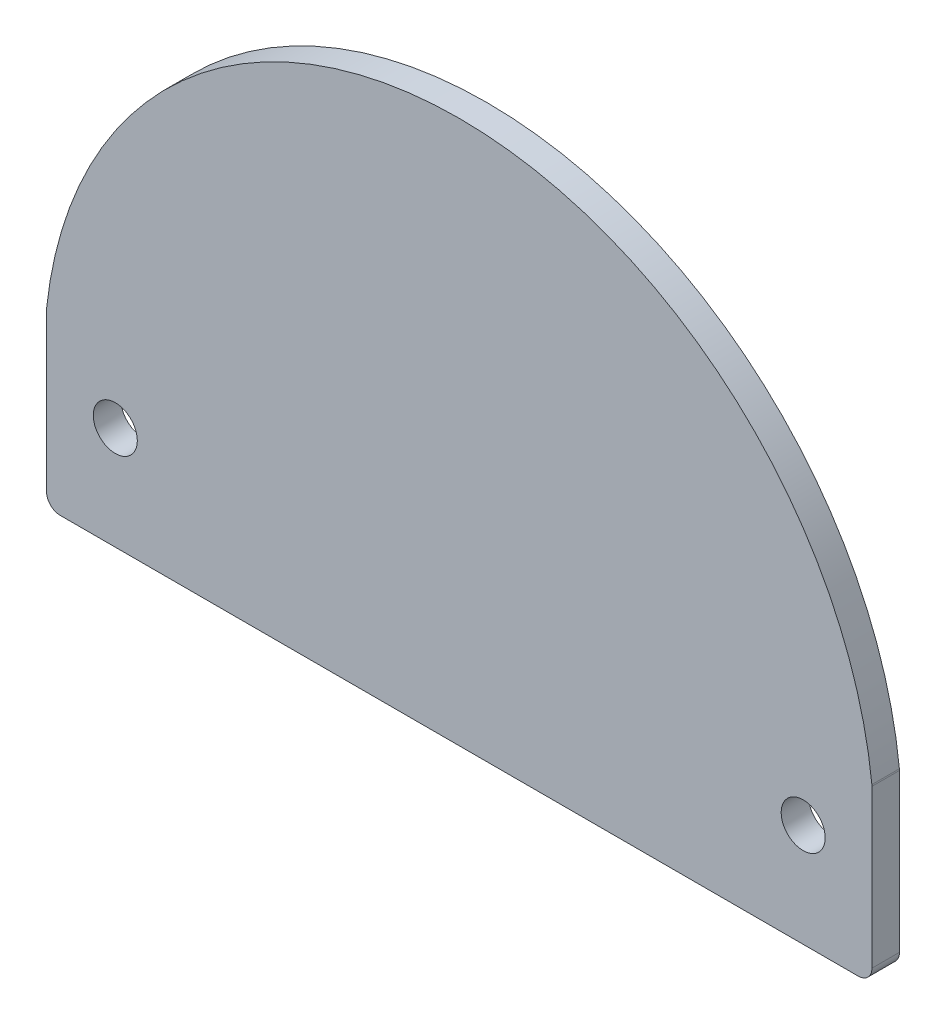
ISO-10303-21;
HEADER;
FILE_DESCRIPTION(('STEP AP214'),'2;1');
FILE_NAME('part.step','',(''),(''),'','','');
FILE_SCHEMA(('AUTOMOTIVE_DESIGN { 1 0 10303 214 1 1 1 1 }'));
ENDSEC;
DATA;
#1=APPLICATION_CONTEXT('core data for automotive mechanical design processes');
#2=APPLICATION_PROTOCOL_DEFINITION('international standard','automotive_design',2000,#1);
#3=PRODUCT_CONTEXT('',#1,'mechanical');
#4=PRODUCT('Part','Part','',(#3));
#5=PRODUCT_RELATED_PRODUCT_CATEGORY('part','',(#4));
#6=PRODUCT_DEFINITION_FORMATION('','',#4);
#7=PRODUCT_DEFINITION_CONTEXT('part definition',#1,'design');
#8=PRODUCT_DEFINITION('design','',#6,#7);
#9=PRODUCT_DEFINITION_SHAPE('','',#8);
#10=(LENGTH_UNIT() NAMED_UNIT(*) SI_UNIT(.MILLI.,.METRE.));
#11=(NAMED_UNIT(*) PLANE_ANGLE_UNIT() SI_UNIT($,.RADIAN.));
#12=(NAMED_UNIT(*) SI_UNIT($,.STERADIAN.) SOLID_ANGLE_UNIT());
#13=UNCERTAINTY_MEASURE_WITH_UNIT(LENGTH_MEASURE(1.E-05),#10,'distance_accuracy_value','');
#14=(GEOMETRIC_REPRESENTATION_CONTEXT(3) GLOBAL_UNCERTAINTY_ASSIGNED_CONTEXT((#13)) GLOBAL_UNIT_ASSIGNED_CONTEXT((#10,
#11,#12)) REPRESENTATION_CONTEXT('',''));
#15=CARTESIAN_POINT('',(0.,0.,0.));
#16=DIRECTION('',(0.,0.,1.));
#17=DIRECTION('',(1.,0.,0.));
#18=AXIS2_PLACEMENT_3D('',#15,#16,#17);
#19=CARTESIAN_POINT('',(0.,-3.16666666666667,2.));
#20=DIRECTION('',(0.,0.,-1.));
#21=DIRECTION('',(-1.,0.,0.));
#22=AXIS2_PLACEMENT_3D('',#19,#20,#21);
#23=CYLINDRICAL_SURFACE('',#22,30.1666666666667);
#24=CARTESIAN_POINT('',(0.,-3.16666666666667,2.));
#25=DIRECTION('',(0.,0.,1.));
#26=DIRECTION('',(-1.,0.,0.));
#27=AXIS2_PLACEMENT_3D('',#24,#25,#26);
#28=CIRCLE('',#27,30.1666666666667);
#29=CARTESIAN_POINT('',(29.9942857142857,0.0536752821911997,2.));
#30=VERTEX_POINT('',#29);
#31=CARTESIAN_POINT('',(-29.9942857142857,0.0536752821912001,2.));
#32=VERTEX_POINT('',#31);
#33=EDGE_CURVE('E134',#30,#32,#28,.T.);
#34=ORIENTED_EDGE('',*,*,#33,.F.);
#35=DIRECTION('',(0.,0.,-1.));
#36=VECTOR('',#35,1.);
#37=CARTESIAN_POINT('',(29.9942857142857,0.0536752821912001,2.));
#38=LINE('',#37,#36);
#39=CARTESIAN_POINT('',(29.9942857142857,0.0536752821911997,0.));
#40=VERTEX_POINT('',#39);
#41=EDGE_CURVE('E11',#30,#40,#38,.T.);
#42=ORIENTED_EDGE('',*,*,#41,.T.);
#43=CARTESIAN_POINT('',(0.,-3.16666666666667,0.));
#44=DIRECTION('',(0.,0.,1.));
#45=DIRECTION('',(-1.,0.,0.));
#46=AXIS2_PLACEMENT_3D('',#43,#44,#45);
#47=CIRCLE('',#46,30.1666666666667);
#48=CARTESIAN_POINT('',(-29.9942857142857,0.0536752821912001,0.));
#49=VERTEX_POINT('',#48);
#50=EDGE_CURVE('E136',#40,#49,#47,.T.);
#51=ORIENTED_EDGE('',*,*,#50,.T.);
#52=DIRECTION('',(0.,0.,-1.));
#53=VECTOR('',#52,1.);
#54=CARTESIAN_POINT('',(-29.9942857142857,0.0536752821912009,2.));
#55=LINE('',#54,#53);
#56=EDGE_CURVE('E47',#49,#32,#55,.F.);
#57=ORIENTED_EDGE('',*,*,#56,.T.);
#58=EDGE_LOOP('',(#34,#42,#51,#57));
#59=FACE_BOUND('',#58,.T.);
#60=ADVANCED_FACE('F39',(#59),#23,.T.);
#61=CARTESIAN_POINT('',(-30.,0.,2.));
#62=DIRECTION('',(1.,0.,0.));
#63=DIRECTION('',(0.,0.,-1.));
#64=AXIS2_PLACEMENT_3D('',#61,#62,#63);
#65=PLANE('',#64);
#66=DIRECTION('',(0.,-1.,0.));
#67=VECTOR('',#66,1.);
#68=CARTESIAN_POINT('',(-30.,0.,0.));
#69=LINE('',#68,#67);
#70=CARTESIAN_POINT('',(-30.,-0.053076384621768,0.));
#71=VERTEX_POINT('',#70);
#72=CARTESIAN_POINT('',(-30.,-11.5,0.));
#73=VERTEX_POINT('',#72);
#74=EDGE_CURVE('E132',#71,#73,#69,.T.);
#75=ORIENTED_EDGE('',*,*,#74,.T.);
#76=DIRECTION('',(0.,0.,-1.));
#77=VECTOR('',#76,1.);
#78=CARTESIAN_POINT('',(-30.,-11.5,2.));
#79=LINE('',#78,#77);
#80=CARTESIAN_POINT('',(-30.,-11.5,2.));
#81=VERTEX_POINT('',#80);
#82=EDGE_CURVE('E111',#73,#81,#79,.F.);
#83=ORIENTED_EDGE('',*,*,#82,.T.);
#84=DIRECTION('',(0.,-1.,0.));
#85=VECTOR('',#84,1.);
#86=CARTESIAN_POINT('',(-30.,0.,2.));
#87=LINE('',#86,#85);
#88=CARTESIAN_POINT('',(-30.,-0.053076384621768,2.));
#89=VERTEX_POINT('',#88);
#90=EDGE_CURVE('E172',#89,#81,#87,.T.);
#91=ORIENTED_EDGE('',*,*,#90,.F.);
#92=DIRECTION('',(0.,0.,-1.));
#93=VECTOR('',#92,1.);
#94=CARTESIAN_POINT('',(-30.,-0.053076384621768,2.));
#95=LINE('',#94,#93);
#96=EDGE_CURVE('E116',#89,#71,#95,.T.);
#97=ORIENTED_EDGE('',*,*,#96,.T.);
#98=EDGE_LOOP('',(#75,#83,#91,#97));
#99=FACE_BOUND('',#98,.T.);
#100=ADVANCED_FACE('F176',(#99),#65,.F.);
#101=CARTESIAN_POINT('',(-30.,-12.5,2.));
#102=DIRECTION('',(0.,1.,0.));
#103=DIRECTION('',(0.,0.,1.));
#104=AXIS2_PLACEMENT_3D('',#101,#102,#103);
#105=PLANE('',#104);
#106=DIRECTION('',(1.,0.,0.));
#107=VECTOR('',#106,1.);
#108=CARTESIAN_POINT('',(-30.,-12.5,2.));
#109=LINE('',#108,#107);
#110=CARTESIAN_POINT('',(-29.,-12.5,2.));
#111=VERTEX_POINT('',#110);
#112=CARTESIAN_POINT('',(29.,-12.5,2.));
#113=VERTEX_POINT('',#112);
#114=EDGE_CURVE('E125',#111,#113,#109,.T.);
#115=ORIENTED_EDGE('',*,*,#114,.F.);
#116=DIRECTION('',(0.,0.,-1.));
#117=VECTOR('',#116,1.);
#118=CARTESIAN_POINT('',(-29.,-12.5,2.));
#119=LINE('',#118,#117);
#120=CARTESIAN_POINT('',(-29.,-12.5,0.));
#121=VERTEX_POINT('',#120);
#122=EDGE_CURVE('E110',#111,#121,#119,.T.);
#123=ORIENTED_EDGE('',*,*,#122,.T.);
#124=DIRECTION('',(1.,0.,0.));
#125=VECTOR('',#124,1.);
#126=CARTESIAN_POINT('',(-30.,-12.5,0.));
#127=LINE('',#126,#125);
#128=CARTESIAN_POINT('',(29.,-12.5,0.));
#129=VERTEX_POINT('',#128);
#130=EDGE_CURVE('E123',#121,#129,#127,.T.);
#131=ORIENTED_EDGE('',*,*,#130,.T.);
#132=DIRECTION('',(0.,0.,-1.));
#133=VECTOR('',#132,1.);
#134=CARTESIAN_POINT('',(29.,-12.5,2.));
#135=LINE('',#134,#133);
#136=EDGE_CURVE('E127',#129,#113,#135,.F.);
#137=ORIENTED_EDGE('',*,*,#136,.T.);
#138=EDGE_LOOP('',(#115,#123,#131,#137));
#139=FACE_BOUND('',#138,.T.);
#140=ADVANCED_FACE('F122',(#139),#105,.F.);
#141=CARTESIAN_POINT('',(30.,0.,2.));
#142=DIRECTION('',(-1.,0.,0.));
#143=DIRECTION('',(0.,0.,1.));
#144=AXIS2_PLACEMENT_3D('',#141,#142,#143);
#145=PLANE('',#144);
#146=DIRECTION('',(0.,1.,0.));
#147=VECTOR('',#146,1.);
#148=CARTESIAN_POINT('',(30.,0.,2.));
#149=LINE('',#148,#147);
#150=CARTESIAN_POINT('',(30.,-11.5,2.));
#151=VERTEX_POINT('',#150);
#152=CARTESIAN_POINT('',(30.,-0.053076384621768,2.));
#153=VERTEX_POINT('',#152);
#154=EDGE_CURVE('E140',#151,#153,#149,.T.);
#155=ORIENTED_EDGE('',*,*,#154,.F.);
#156=DIRECTION('',(0.,0.,-1.));
#157=VECTOR('',#156,1.);
#158=CARTESIAN_POINT('',(30.,-11.5,2.));
#159=LINE('',#158,#157);
#160=CARTESIAN_POINT('',(30.,-11.5,0.));
#161=VERTEX_POINT('',#160);
#162=EDGE_CURVE('E157',#151,#161,#159,.T.);
#163=ORIENTED_EDGE('',*,*,#162,.T.);
#164=DIRECTION('',(0.,1.,0.));
#165=VECTOR('',#164,1.);
#166=CARTESIAN_POINT('',(30.,0.,0.));
#167=LINE('',#166,#165);
#168=CARTESIAN_POINT('',(30.,-0.053076384621768,0.));
#169=VERTEX_POINT('',#168);
#170=EDGE_CURVE('E131',#161,#169,#167,.T.);
#171=ORIENTED_EDGE('',*,*,#170,.T.);
#172=DIRECTION('',(0.,0.,-1.));
#173=VECTOR('',#172,1.);
#174=CARTESIAN_POINT('',(30.,-0.053076384621768,2.));
#175=LINE('',#174,#173);
#176=EDGE_CURVE('E54',#169,#153,#175,.F.);
#177=ORIENTED_EDGE('',*,*,#176,.T.);
#178=EDGE_LOOP('',(#155,#163,#171,#177));
#179=FACE_BOUND('',#178,.T.);
#180=ADVANCED_FACE('F205',(#179),#145,.F.);
#181=CARTESIAN_POINT('',(0.,-3.16666666666667,2.));
#182=DIRECTION('',(0.,0.,-1.));
#183=DIRECTION('',(-1.,0.,0.));
#184=AXIS2_PLACEMENT_3D('',#181,#182,#183);
#185=PLANE('',#184);
#186=CARTESIAN_POINT('',(25.,-5.,2.));
#187=DIRECTION('',(0.,0.,-1.));
#188=DIRECTION('',(-1.,0.,0.));
#189=AXIS2_PLACEMENT_3D('',#186,#187,#188);
#190=CIRCLE('',#189,1.6);
#191=CARTESIAN_POINT('',(23.4,-5.,2.));
#192=VERTEX_POINT('',#191);
#193=EDGE_CURVE('E187',#192,#192,#190,.T.);
#194=ORIENTED_EDGE('',*,*,#193,.T.);
#195=EDGE_LOOP('',(#194));
#196=FACE_BOUND('',#195,.T.);
#197=CARTESIAN_POINT('',(-25.,-5.,2.));
#198=DIRECTION('',(0.,0.,-1.));
#199=DIRECTION('',(-1.,0.,0.));
#200=AXIS2_PLACEMENT_3D('',#197,#198,#199);
#201=CIRCLE('',#200,1.6);
#202=CARTESIAN_POINT('',(-26.6,-5.,2.));
#203=VERTEX_POINT('',#202);
#204=EDGE_CURVE('E177',#203,#203,#201,.T.);
#205=ORIENTED_EDGE('',*,*,#204,.T.);
#206=EDGE_LOOP('',(#205));
#207=FACE_BOUND('',#206,.T.);
#208=ORIENTED_EDGE('',*,*,#90,.T.);
#209=CARTESIAN_POINT('',(-29.,-11.5,2.));
#210=DIRECTION('',(0.,0.,-1.));
#211=DIRECTION('',(-1.,0.,0.));
#212=AXIS2_PLACEMENT_3D('',#209,#210,#211);
#213=CIRCLE('',#212,1.);
#214=EDGE_CURVE('E154',#81,#111,#213,.F.);
#215=ORIENTED_EDGE('',*,*,#214,.T.);
#216=ORIENTED_EDGE('',*,*,#114,.T.);
#217=CARTESIAN_POINT('',(29.,-11.5,2.));
#218=DIRECTION('',(0.,0.,-1.));
#219=DIRECTION('',(-1.,0.,0.));
#220=AXIS2_PLACEMENT_3D('',#217,#218,#219);
#221=CIRCLE('',#220,1.);
#222=EDGE_CURVE('E61',#113,#151,#221,.F.);
#223=ORIENTED_EDGE('',*,*,#222,.T.);
#224=ORIENTED_EDGE('',*,*,#154,.T.);
#225=CARTESIAN_POINT('',(29.,-0.053076384621768,2.));
#226=DIRECTION('',(0.,0.,-1.));
#227=DIRECTION('',(-1.,0.,0.));
#228=AXIS2_PLACEMENT_3D('',#225,#226,#227);
#229=CIRCLE('',#228,1.);
#230=EDGE_CURVE('E151',#153,#30,#229,.F.);
#231=ORIENTED_EDGE('',*,*,#230,.T.);
#232=ORIENTED_EDGE('',*,*,#33,.T.);
#233=CARTESIAN_POINT('',(-29.,-0.053076384621768,2.));
#234=DIRECTION('',(0.,0.,-1.));
#235=DIRECTION('',(-1.,0.,0.));
#236=AXIS2_PLACEMENT_3D('',#233,#234,#235);
#237=CIRCLE('',#236,1.);
#238=EDGE_CURVE('E149',#32,#89,#237,.F.);
#239=ORIENTED_EDGE('',*,*,#238,.T.);
#240=EDGE_LOOP('',(#208,#215,#216,#223,#224,#231,#232,#239));
#241=FACE_BOUND('',#240,.T.);
#242=ADVANCED_FACE('F169',(#196,#207,#241),#185,.F.);
#243=CARTESIAN_POINT('',(0.,-3.16666666666667,0.));
#244=DIRECTION('',(0.,0.,-1.));
#245=DIRECTION('',(-1.,0.,0.));
#246=AXIS2_PLACEMENT_3D('',#243,#244,#245);
#247=PLANE('',#246);
#248=CARTESIAN_POINT('',(25.,-5.,0.));
#249=DIRECTION('',(0.,0.,1.));
#250=DIRECTION('',(1.,0.,0.));
#251=AXIS2_PLACEMENT_3D('',#248,#249,#250);
#252=CIRCLE('',#251,1.6);
#253=CARTESIAN_POINT('',(26.6,-5.,0.));
#254=VERTEX_POINT('',#253);
#255=EDGE_CURVE('E190',#254,#254,#252,.T.);
#256=ORIENTED_EDGE('',*,*,#255,.T.);
#257=EDGE_LOOP('',(#256));
#258=FACE_BOUND('',#257,.T.);
#259=CARTESIAN_POINT('',(-25.,-5.,0.));
#260=DIRECTION('',(0.,0.,1.));
#261=DIRECTION('',(1.,0.,0.));
#262=AXIS2_PLACEMENT_3D('',#259,#260,#261);
#263=CIRCLE('',#262,1.6);
#264=CARTESIAN_POINT('',(-23.4,-5.,0.));
#265=VERTEX_POINT('',#264);
#266=EDGE_CURVE('E179',#265,#265,#263,.T.);
#267=ORIENTED_EDGE('',*,*,#266,.T.);
#268=EDGE_LOOP('',(#267));
#269=FACE_BOUND('',#268,.T.);
#270=ORIENTED_EDGE('',*,*,#130,.F.);
#271=CARTESIAN_POINT('',(-29.,-11.5,0.));
#272=DIRECTION('',(0.,0.,-1.));
#273=DIRECTION('',(-1.,0.,0.));
#274=AXIS2_PLACEMENT_3D('',#271,#272,#273);
#275=CIRCLE('',#274,1.);
#276=EDGE_CURVE('E106',#121,#73,#275,.T.);
#277=ORIENTED_EDGE('',*,*,#276,.T.);
#278=ORIENTED_EDGE('',*,*,#74,.F.);
#279=CARTESIAN_POINT('',(-29.,-0.053076384621768,0.));
#280=DIRECTION('',(0.,0.,-1.));
#281=DIRECTION('',(-1.,0.,0.));
#282=AXIS2_PLACEMENT_3D('',#279,#280,#281);
#283=CIRCLE('',#282,1.);
#284=EDGE_CURVE('E126',#71,#49,#283,.T.);
#285=ORIENTED_EDGE('',*,*,#284,.T.);
#286=ORIENTED_EDGE('',*,*,#50,.F.);
#287=CARTESIAN_POINT('',(29.,-0.053076384621768,0.));
#288=DIRECTION('',(0.,0.,-1.));
#289=DIRECTION('',(-1.,0.,0.));
#290=AXIS2_PLACEMENT_3D('',#287,#288,#289);
#291=CIRCLE('',#290,1.);
#292=EDGE_CURVE('E143',#40,#169,#291,.T.);
#293=ORIENTED_EDGE('',*,*,#292,.T.);
#294=ORIENTED_EDGE('',*,*,#170,.F.);
#295=CARTESIAN_POINT('',(29.,-11.5,0.));
#296=DIRECTION('',(0.,0.,-1.));
#297=DIRECTION('',(-1.,0.,0.));
#298=AXIS2_PLACEMENT_3D('',#295,#296,#297);
#299=CIRCLE('',#298,1.);
#300=EDGE_CURVE('E117',#161,#129,#299,.T.);
#301=ORIENTED_EDGE('',*,*,#300,.T.);
#302=EDGE_LOOP('',(#270,#277,#278,#285,#286,#293,#294,#301));
#303=FACE_BOUND('',#302,.T.);
#304=ADVANCED_FACE('F129',(#258,#269,#303),#247,.T.);
#305=CARTESIAN_POINT('',(-25.,-5.,0.));
#306=DIRECTION('',(0.,0.,1.));
#307=DIRECTION('',(1.,0.,0.));
#308=AXIS2_PLACEMENT_3D('',#305,#306,#307);
#309=CYLINDRICAL_SURFACE('',#308,1.6);
#310=ORIENTED_EDGE('',*,*,#266,.F.);
#311=EDGE_LOOP('',(#310));
#312=FACE_BOUND('',#311,.T.);
#313=ORIENTED_EDGE('',*,*,#204,.F.);
#314=EDGE_LOOP('',(#313));
#315=FACE_BOUND('',#314,.T.);
#316=ADVANCED_FACE('F199',(#312,#315),#309,.F.);
#317=CARTESIAN_POINT('',(25.,-5.,0.));
#318=DIRECTION('',(0.,0.,1.));
#319=DIRECTION('',(1.,0.,0.));
#320=AXIS2_PLACEMENT_3D('',#317,#318,#319);
#321=CYLINDRICAL_SURFACE('',#320,1.6);
#322=ORIENTED_EDGE('',*,*,#255,.F.);
#323=EDGE_LOOP('',(#322));
#324=FACE_BOUND('',#323,.T.);
#325=ORIENTED_EDGE('',*,*,#193,.F.);
#326=EDGE_LOOP('',(#325));
#327=FACE_BOUND('',#326,.T.);
#328=ADVANCED_FACE('F196',(#324,#327),#321,.F.);
#329=CARTESIAN_POINT('',(-29.,-11.5,2.));
#330=DIRECTION('',(0.,0.,-1.));
#331=DIRECTION('',(-1.,0.,0.));
#332=AXIS2_PLACEMENT_3D('',#329,#330,#331);
#333=CYLINDRICAL_SURFACE('',#332,1.);
#334=ORIENTED_EDGE('',*,*,#214,.F.);
#335=ORIENTED_EDGE('',*,*,#82,.F.);
#336=ORIENTED_EDGE('',*,*,#276,.F.);
#337=ORIENTED_EDGE('',*,*,#122,.F.);
#338=EDGE_LOOP('',(#334,#335,#336,#337));
#339=FACE_BOUND('',#338,.T.);
#340=ADVANCED_FACE('F109',(#339),#333,.T.);
#341=CARTESIAN_POINT('',(29.,-11.5,2.));
#342=DIRECTION('',(0.,0.,-1.));
#343=DIRECTION('',(-1.,0.,0.));
#344=AXIS2_PLACEMENT_3D('',#341,#342,#343);
#345=CYLINDRICAL_SURFACE('',#344,1.);
#346=ORIENTED_EDGE('',*,*,#222,.F.);
#347=ORIENTED_EDGE('',*,*,#136,.F.);
#348=ORIENTED_EDGE('',*,*,#300,.F.);
#349=ORIENTED_EDGE('',*,*,#162,.F.);
#350=EDGE_LOOP('',(#346,#347,#348,#349));
#351=FACE_BOUND('',#350,.T.);
#352=ADVANCED_FACE('F227',(#351),#345,.T.);
#353=CARTESIAN_POINT('',(29.,-0.053076384621768,2.));
#354=DIRECTION('',(0.,0.,-1.));
#355=DIRECTION('',(-1.,0.,0.));
#356=AXIS2_PLACEMENT_3D('',#353,#354,#355);
#357=CYLINDRICAL_SURFACE('',#356,1.);
#358=ORIENTED_EDGE('',*,*,#230,.F.);
#359=ORIENTED_EDGE('',*,*,#176,.F.);
#360=ORIENTED_EDGE('',*,*,#292,.F.);
#361=ORIENTED_EDGE('',*,*,#41,.F.);
#362=EDGE_LOOP('',(#358,#359,#360,#361));
#363=FACE_BOUND('',#362,.T.);
#364=ADVANCED_FACE('F229',(#363),#357,.T.);
#365=CARTESIAN_POINT('',(-29.,-0.053076384621768,2.));
#366=DIRECTION('',(0.,0.,-1.));
#367=DIRECTION('',(-1.,0.,0.));
#368=AXIS2_PLACEMENT_3D('',#365,#366,#367);
#369=CYLINDRICAL_SURFACE('',#368,1.);
#370=ORIENTED_EDGE('',*,*,#238,.F.);
#371=ORIENTED_EDGE('',*,*,#56,.F.);
#372=ORIENTED_EDGE('',*,*,#284,.F.);
#373=ORIENTED_EDGE('',*,*,#96,.F.);
#374=EDGE_LOOP('',(#370,#371,#372,#373));
#375=FACE_BOUND('',#374,.T.);
#376=ADVANCED_FACE('F41',(#375),#369,.T.);
#377=CLOSED_SHELL('',(#60,#100,#140,#180,#242,#304,#316,#328,#340,#352,#364,#376));
#378=MANIFOLD_SOLID_BREP('B2',#377);
#379=ADVANCED_BREP_SHAPE_REPRESENTATION('',(#18,#378),#14);
#380=SHAPE_DEFINITION_REPRESENTATION(#9,#379);
ENDSEC;
END-ISO-10303-21;
